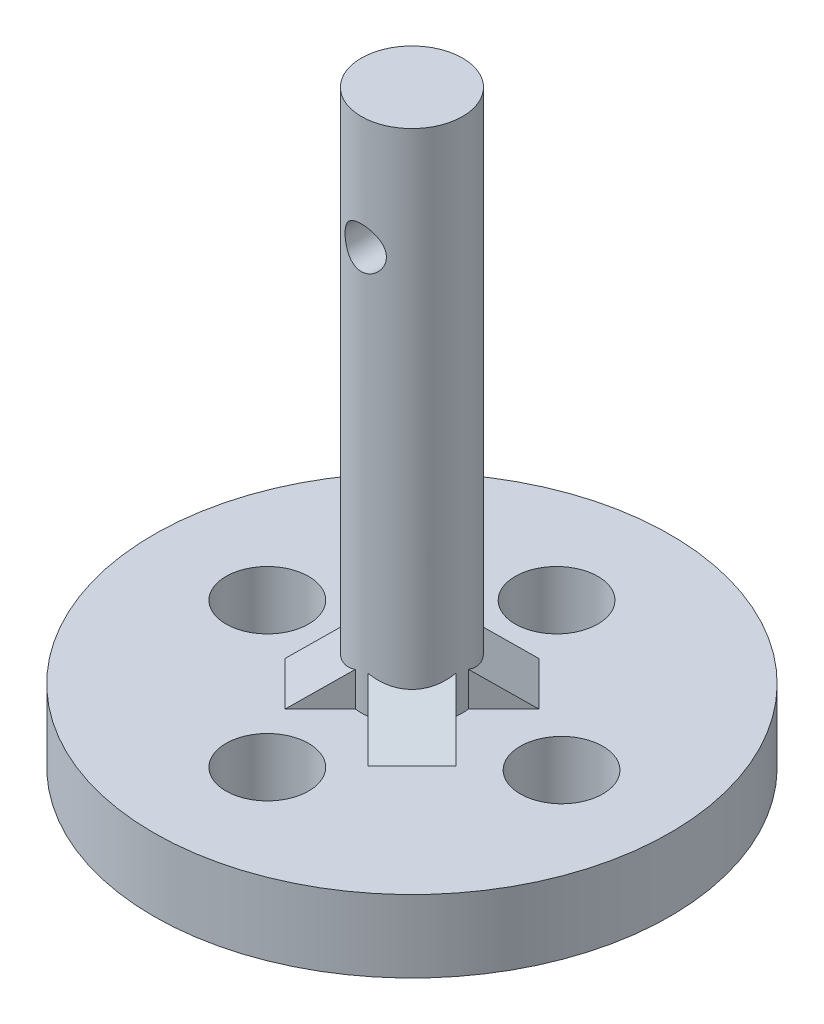
ISO-10303-21;
HEADER;
FILE_DESCRIPTION(('STEP AP214'),'2;1');
FILE_NAME('part.step','',(''),(''),'','','');
FILE_SCHEMA(('AUTOMOTIVE_DESIGN { 1 0 10303 214 1 1 1 1 }'));
ENDSEC;
DATA;
#1=APPLICATION_CONTEXT('core data for automotive mechanical design processes');
#2=APPLICATION_PROTOCOL_DEFINITION('international standard','automotive_design',2000,#1);
#3=PRODUCT_CONTEXT('',#1,'mechanical');
#4=PRODUCT('Part','Part','',(#3));
#5=PRODUCT_RELATED_PRODUCT_CATEGORY('part','',(#4));
#6=PRODUCT_DEFINITION_FORMATION('','',#4);
#7=PRODUCT_DEFINITION_CONTEXT('part definition',#1,'design');
#8=PRODUCT_DEFINITION('design','',#6,#7);
#9=PRODUCT_DEFINITION_SHAPE('','',#8);
#10=(LENGTH_UNIT() NAMED_UNIT(*) SI_UNIT(.MILLI.,.METRE.));
#11=(NAMED_UNIT(*) PLANE_ANGLE_UNIT() SI_UNIT($,.RADIAN.));
#12=(NAMED_UNIT(*) SI_UNIT($,.STERADIAN.) SOLID_ANGLE_UNIT());
#13=UNCERTAINTY_MEASURE_WITH_UNIT(LENGTH_MEASURE(1.E-05),#10,'distance_accuracy_value','');
#14=(GEOMETRIC_REPRESENTATION_CONTEXT(3) GLOBAL_UNCERTAINTY_ASSIGNED_CONTEXT((#13)) GLOBAL_UNIT_ASSIGNED_CONTEXT((#10,
#11,#12)) REPRESENTATION_CONTEXT('',''));
#15=CARTESIAN_POINT('',(0.,0.,0.));
#16=DIRECTION('',(0.,0.,1.));
#17=DIRECTION('',(1.,0.,0.));
#18=AXIS2_PLACEMENT_3D('',#15,#16,#17);
#19=CARTESIAN_POINT('',(0.,3.5,0.));
#20=DIRECTION('',(0.,-1.,0.));
#21=DIRECTION('',(0.,0.,-1.));
#22=AXIS2_PLACEMENT_3D('',#19,#20,#21);
#23=CYLINDRICAL_SURFACE('',#22,12.5);
#24=CARTESIAN_POINT('',(0.,3.5,0.));
#25=DIRECTION('',(0.,1.,0.));
#26=DIRECTION('',(0.,0.,1.));
#27=AXIS2_PLACEMENT_3D('',#24,#25,#26);
#28=CIRCLE('',#27,12.5);
#29=CARTESIAN_POINT('',(0.,3.5,12.5));
#30=VERTEX_POINT('',#29);
#31=EDGE_CURVE('E237',#30,#30,#28,.T.);
#32=ORIENTED_EDGE('',*,*,#31,.F.);
#33=EDGE_LOOP('',(#32));
#34=FACE_BOUND('',#33,.T.);
#35=CARTESIAN_POINT('',(0.,0.,0.));
#36=DIRECTION('',(0.,1.,0.));
#37=DIRECTION('',(0.,0.,1.));
#38=AXIS2_PLACEMENT_3D('',#35,#36,#37);
#39=CIRCLE('',#38,12.5);
#40=CARTESIAN_POINT('',(0.,0.,12.5));
#41=VERTEX_POINT('',#40);
#42=EDGE_CURVE('E234',#41,#41,#39,.T.);
#43=ORIENTED_EDGE('',*,*,#42,.T.);
#44=EDGE_LOOP('',(#43));
#45=FACE_BOUND('',#44,.T.);
#46=ADVANCED_FACE('F38',(#34,#45),#23,.T.);
#47=CARTESIAN_POINT('',(0.,3.5,0.));
#48=DIRECTION('',(0.,1.,0.));
#49=DIRECTION('',(0.,0.,1.));
#50=AXIS2_PLACEMENT_3D('',#47,#48,#49);
#51=PLANE('',#50);
#52=ORIENTED_EDGE('',*,*,#31,.T.);
#53=EDGE_LOOP('',(#52));
#54=FACE_BOUND('',#53,.T.);
#55=DIRECTION('',(0.707106781186546,0.,0.707106781186549));
#56=VECTOR('',#55,1.);
#57=CARTESIAN_POINT('',(3.0691286647991,3.5,-3.06912866479909));
#58=LINE('',#57,#56);
#59=CARTESIAN_POINT('',(4.12978883657892,3.5,-2.00846849301927));
#60=VERTEX_POINT('',#59);
#61=CARTESIAN_POINT('',(2.00846849301928,3.5,-4.12978883657892));
#62=VERTEX_POINT('',#61);
#63=EDGE_CURVE('E173',#60,#62,#58,.F.);
#64=ORIENTED_EDGE('',*,*,#63,.F.);
#65=DIRECTION('',(0.707106781186549,0.,-0.707106781186546));
#66=VECTOR('',#65,1.);
#67=CARTESIAN_POINT('',(1.06066017177982,3.5,1.06066017177982));
#68=LINE('',#67,#66);
#69=CARTESIAN_POINT('',(2.43042292496009,3.5,-0.309102581400447));
#70=VERTEX_POINT('',#69);
#71=EDGE_CURVE('E170',#70,#60,#68,.T.);
#72=ORIENTED_EDGE('',*,*,#71,.F.);
#73=CARTESIAN_POINT('',(0.,3.5,0.));
#74=DIRECTION('',(0.,1.,0.));
#75=DIRECTION('',(0.,0.,1.));
#76=AXIS2_PLACEMENT_3D('',#73,#74,#75);
#77=CIRCLE('',#76,2.45);
#78=CARTESIAN_POINT('',(2.43042292496009,3.5,0.309102581400456));
#79=VERTEX_POINT('',#78);
#80=EDGE_CURVE('E142',#79,#70,#77,.T.);
#81=ORIENTED_EDGE('',*,*,#80,.F.);
#82=DIRECTION('',(0.707106781186546,0.,0.707106781186549));
#83=VECTOR('',#82,1.);
#84=CARTESIAN_POINT('',(1.06066017177982,3.5,-1.06066017177982));
#85=LINE('',#84,#83);
#86=CARTESIAN_POINT('',(4.50601996303597,3.5,2.38469961947634));
#87=VERTEX_POINT('',#86);
#88=EDGE_CURVE('E198',#79,#87,#85,.T.);
#89=ORIENTED_EDGE('',*,*,#88,.T.);
#90=DIRECTION('',(-0.707106781186549,0.,0.707106781186546));
#91=VECTOR('',#90,1.);
#92=CARTESIAN_POINT('',(3.44535979125614,3.5,3.44535979125616));
#93=LINE('',#92,#91);
#94=CARTESIAN_POINT('',(2.38469961947632,3.5,4.50601996303598));
#95=VERTEX_POINT('',#94);
#96=EDGE_CURVE('E205',#95,#87,#93,.F.);
#97=ORIENTED_EDGE('',*,*,#96,.F.);
#98=DIRECTION('',(0.707106781186546,0.,0.707106781186549));
#99=VECTOR('',#98,1.);
#100=CARTESIAN_POINT('',(-1.06066017177982,3.5,1.06066017177982));
#101=LINE('',#100,#99);
#102=CARTESIAN_POINT('',(0.309102581400447,3.5,2.4304229249601));
#103=VERTEX_POINT('',#102);
#104=EDGE_CURVE('E202',#103,#95,#101,.T.);
#105=ORIENTED_EDGE('',*,*,#104,.F.);
#106=CARTESIAN_POINT('',(-0.309102581400456,3.5,2.43042292496009));
#107=VERTEX_POINT('',#106);
#108=EDGE_CURVE('E140',#107,#103,#77,.T.);
#109=ORIENTED_EDGE('',*,*,#108,.F.);
#110=DIRECTION('',(0.707106781186549,0.,-0.707106781186546));
#111=VECTOR('',#110,1.);
#112=CARTESIAN_POINT('',(1.06066017177982,3.5,1.06066017177982));
#113=LINE('',#112,#111);
#114=CARTESIAN_POINT('',(-2.00846849301929,3.5,4.12978883657892));
#115=VERTEX_POINT('',#114);
#116=EDGE_CURVE('E58',#115,#107,#113,.T.);
#117=ORIENTED_EDGE('',*,*,#116,.F.);
#118=DIRECTION('',(0.707106781186546,0.,0.707106781186549));
#119=VECTOR('',#118,1.);
#120=CARTESIAN_POINT('',(-3.0691286647991,3.5,3.06912866479909));
#121=LINE('',#120,#119);
#122=CARTESIAN_POINT('',(-4.12978883657892,3.5,2.00846849301927));
#123=VERTEX_POINT('',#122);
#124=EDGE_CURVE('E62',#123,#115,#121,.T.);
#125=ORIENTED_EDGE('',*,*,#124,.F.);
#126=DIRECTION('',(0.707106781186549,0.,-0.707106781186546));
#127=VECTOR('',#126,1.);
#128=CARTESIAN_POINT('',(-1.06066017177982,3.5,-1.06066017177982));
#129=LINE('',#128,#127);
#130=CARTESIAN_POINT('',(-2.4304229249601,3.5,0.309102581400447));
#131=VERTEX_POINT('',#130);
#132=EDGE_CURVE('E143',#123,#131,#129,.T.);
#133=ORIENTED_EDGE('',*,*,#132,.T.);
#134=CARTESIAN_POINT('',(-2.43042292496009,3.5,-0.309102581400456));
#135=VERTEX_POINT('',#134);
#136=EDGE_CURVE('E130',#135,#131,#77,.T.);
#137=ORIENTED_EDGE('',*,*,#136,.F.);
#138=DIRECTION('',(0.707106781186546,0.,0.707106781186549));
#139=VECTOR('',#138,1.);
#140=CARTESIAN_POINT('',(-1.06066017177982,3.5,1.06066017177982));
#141=LINE('',#140,#139);
#142=CARTESIAN_POINT('',(-4.64330057061032,3.5,-2.52198022705069));
#143=VERTEX_POINT('',#142);
#144=EDGE_CURVE('E188',#143,#135,#141,.T.);
#145=ORIENTED_EDGE('',*,*,#144,.F.);
#146=DIRECTION('',(-0.707106781186549,0.,0.707106781186546));
#147=VECTOR('',#146,1.);
#148=CARTESIAN_POINT('',(-3.5826403988305,3.5,-3.58264039883051));
#149=LINE('',#148,#147);
#150=CARTESIAN_POINT('',(-2.52198022705067,3.5,-4.64330057061033));
#151=VERTEX_POINT('',#150);
#152=EDGE_CURVE('E190',#151,#143,#149,.T.);
#153=ORIENTED_EDGE('',*,*,#152,.F.);
#154=DIRECTION('',(0.707106781186546,0.,0.707106781186549));
#155=VECTOR('',#154,1.);
#156=CARTESIAN_POINT('',(1.06066017177982,3.5,-1.06066017177982));
#157=LINE('',#156,#155);
#158=CARTESIAN_POINT('',(-0.309102581400447,3.5,-2.4304229249601));
#159=VERTEX_POINT('',#158);
#160=EDGE_CURVE('E185',#151,#159,#157,.T.);
#161=ORIENTED_EDGE('',*,*,#160,.T.);
#162=CARTESIAN_POINT('',(0.309102581400456,3.5,-2.43042292496009));
#163=VERTEX_POINT('',#162);
#164=EDGE_CURVE('E139',#163,#159,#77,.T.);
#165=ORIENTED_EDGE('',*,*,#164,.F.);
#166=DIRECTION('',(0.707106781186549,0.,-0.707106781186546));
#167=VECTOR('',#166,1.);
#168=CARTESIAN_POINT('',(-1.06066017177982,3.5,-1.06066017177982));
#169=LINE('',#168,#167);
#170=EDGE_CURVE('E166',#163,#62,#169,.T.);
#171=ORIENTED_EDGE('',*,*,#170,.T.);
#172=EDGE_LOOP('',(#64,#72,#81,#89,#97,#105,#109,#117,#125,#133,#137,#145,#153,#161,#165,#171));
#173=FACE_BOUND('',#172,.T.);
#174=CARTESIAN_POINT('',(7.24150005218133,3.5,0.));
#175=DIRECTION('',(0.,1.,0.));
#176=DIRECTION('',(0.,0.,1.));
#177=AXIS2_PLACEMENT_3D('',#174,#175,#176);
#178=CIRCLE('',#177,2.);
#179=CARTESIAN_POINT('',(7.24150005218133,3.5,2.));
#180=VERTEX_POINT('',#179);
#181=EDGE_CURVE('E213',#180,#180,#178,.T.);
#182=ORIENTED_EDGE('',*,*,#181,.F.);
#183=EDGE_LOOP('',(#182));
#184=FACE_BOUND('',#183,.T.);
#185=CARTESIAN_POINT('',(0.,3.5,7.));
#186=DIRECTION('',(0.,1.,0.));
#187=DIRECTION('',(0.,0.,1.));
#188=AXIS2_PLACEMENT_3D('',#185,#186,#187);
#189=CIRCLE('',#188,2.);
#190=CARTESIAN_POINT('',(0.,3.5,9.));
#191=VERTEX_POINT('',#190);
#192=EDGE_CURVE('E208',#191,#191,#189,.T.);
#193=ORIENTED_EDGE('',*,*,#192,.F.);
#194=EDGE_LOOP('',(#193));
#195=FACE_BOUND('',#194,.T.);
#196=CARTESIAN_POINT('',(-7.,3.5,0.));
#197=DIRECTION('',(0.,1.,0.));
#198=DIRECTION('',(0.,0.,1.));
#199=AXIS2_PLACEMENT_3D('',#196,#197,#198);
#200=CIRCLE('',#199,2.);
#201=CARTESIAN_POINT('',(-7.,3.5,2.));
#202=VERTEX_POINT('',#201);
#203=EDGE_CURVE('E212',#202,#202,#200,.T.);
#204=ORIENTED_EDGE('',*,*,#203,.F.);
#205=EDGE_LOOP('',(#204));
#206=FACE_BOUND('',#205,.T.);
#207=CARTESIAN_POINT('',(0.,3.5,-7.));
#208=DIRECTION('',(0.,1.,0.));
#209=DIRECTION('',(0.,0.,1.));
#210=AXIS2_PLACEMENT_3D('',#207,#208,#209);
#211=CIRCLE('',#210,2.);
#212=CARTESIAN_POINT('',(0.,3.5,-5.));
#213=VERTEX_POINT('',#212);
#214=EDGE_CURVE('E224',#213,#213,#211,.T.);
#215=ORIENTED_EDGE('',*,*,#214,.F.);
#216=EDGE_LOOP('',(#215));
#217=FACE_BOUND('',#216,.T.);
#218=ADVANCED_FACE('F144',(#54,#173,#184,#195,#206,#217),#51,.T.);
#219=CARTESIAN_POINT('',(0.,0.,0.));
#220=DIRECTION('',(0.,1.,0.));
#221=DIRECTION('',(0.,0.,1.));
#222=AXIS2_PLACEMENT_3D('',#219,#220,#221);
#223=PLANE('',#222);
#224=ORIENTED_EDGE('',*,*,#42,.F.);
#225=EDGE_LOOP('',(#224));
#226=FACE_BOUND('',#225,.T.);
#227=CARTESIAN_POINT('',(7.24150005218133,0.,0.));
#228=DIRECTION('',(0.,1.,0.));
#229=DIRECTION('',(0.,0.,1.));
#230=AXIS2_PLACEMENT_3D('',#227,#228,#229);
#231=CIRCLE('',#230,2.);
#232=CARTESIAN_POINT('',(7.24150005218133,0.,2.));
#233=VERTEX_POINT('',#232);
#234=EDGE_CURVE('E209',#233,#233,#231,.T.);
#235=ORIENTED_EDGE('',*,*,#234,.T.);
#236=EDGE_LOOP('',(#235));
#237=FACE_BOUND('',#236,.T.);
#238=CARTESIAN_POINT('',(0.,0.,7.));
#239=DIRECTION('',(0.,1.,0.));
#240=DIRECTION('',(0.,0.,1.));
#241=AXIS2_PLACEMENT_3D('',#238,#239,#240);
#242=CIRCLE('',#241,2.);
#243=CARTESIAN_POINT('',(0.,0.,9.));
#244=VERTEX_POINT('',#243);
#245=EDGE_CURVE('E216',#244,#244,#242,.T.);
#246=ORIENTED_EDGE('',*,*,#245,.T.);
#247=EDGE_LOOP('',(#246));
#248=FACE_BOUND('',#247,.T.);
#249=CARTESIAN_POINT('',(-7.,0.,0.));
#250=DIRECTION('',(0.,1.,0.));
#251=DIRECTION('',(0.,0.,1.));
#252=AXIS2_PLACEMENT_3D('',#249,#250,#251);
#253=CIRCLE('',#252,2.);
#254=CARTESIAN_POINT('',(-7.,0.,2.));
#255=VERTEX_POINT('',#254);
#256=EDGE_CURVE('E221',#255,#255,#253,.T.);
#257=ORIENTED_EDGE('',*,*,#256,.T.);
#258=EDGE_LOOP('',(#257));
#259=FACE_BOUND('',#258,.T.);
#260=CARTESIAN_POINT('',(0.,0.,-7.));
#261=DIRECTION('',(0.,1.,0.));
#262=DIRECTION('',(0.,0.,1.));
#263=AXIS2_PLACEMENT_3D('',#260,#261,#262);
#264=CIRCLE('',#263,2.);
#265=CARTESIAN_POINT('',(0.,0.,-5.));
#266=VERTEX_POINT('',#265);
#267=EDGE_CURVE('E227',#266,#266,#264,.T.);
#268=ORIENTED_EDGE('',*,*,#267,.T.);
#269=EDGE_LOOP('',(#268));
#270=FACE_BOUND('',#269,.T.);
#271=ADVANCED_FACE('F336',(#226,#237,#248,#259,#270),#223,.F.);
#272=CARTESIAN_POINT('',(0.,28.5,0.));
#273=DIRECTION('',(0.,-1.,0.));
#274=DIRECTION('',(0.,0.,-1.));
#275=AXIS2_PLACEMENT_3D('',#272,#273,#274);
#276=CYLINDRICAL_SURFACE('',#275,2.45);
#277=CARTESIAN_POINT('',(0.,24.,-2.45));
#278=CARTESIAN_POINT('',(-0.0536589367703449,23.9999946218099,-2.4499959895045));
#279=CARTESIAN_POINT('',(-0.10740686621529,23.9956553668991,-2.44821661039311));
#280=CARTESIAN_POINT('',(-0.213383659784766,23.9784503808,-2.44127145292646));
#281=CARTESIAN_POINT('',(-0.265608084618532,23.9655619138055,-2.43609664515377));
#282=CARTESIAN_POINT('',(-0.366832691632844,23.9318096118804,-2.42291752428269));
#283=CARTESIAN_POINT('',(-0.415842980270308,23.9109723345189,-2.41492263989994));
#284=CARTESIAN_POINT('',(-0.509626353878585,23.8620213231173,-2.3968864283533));
#285=CARTESIAN_POINT('',(-0.554400811854337,23.8339099580169,-2.38684576765977));
#286=CARTESIAN_POINT('',(-0.640686440667424,23.769764537089,-2.36518224664398));
#287=CARTESIAN_POINT('',(-0.681964646093683,23.7334342747117,-2.3535089486563));
#288=CARTESIAN_POINT('',(-0.758040964916322,23.6545080303574,-2.33012039656547));
#289=CARTESIAN_POINT('',(-0.792835792351389,23.6119088906033,-2.31840512423766));
#290=CARTESIAN_POINT('',(-0.85656283024562,23.5192368272157,-2.29564805850799));
#291=CARTESIAN_POINT('',(-0.885144764759956,23.4689075489517,-2.28466338426556));
#292=CARTESIAN_POINT('',(-0.933333305120254,23.3636412564063,-2.26540667076149));
#293=CARTESIAN_POINT('',(-0.952944349362637,23.3087065366459,-2.2571332906483));
#294=CARTESIAN_POINT('',(-0.981682541168728,23.1984682981396,-2.24477953486603));
#295=CARTESIAN_POINT('',(-0.991256893941519,23.1433020485017,-2.24052124028536));
#296=CARTESIAN_POINT('',(-1.00104609480797,23.0319942855991,-2.23616601681074));
#297=CARTESIAN_POINT('',(-1.00126581144282,22.9758532948509,-2.23606692329619));
#298=CARTESIAN_POINT('',(-0.992677397097407,22.8685620608712,-2.23989010237453));
#299=CARTESIAN_POINT('',(-0.984527095588799,22.8173466568171,-2.24351935780235));
#300=CARTESIAN_POINT('',(-0.960530043846643,22.7170862430505,-2.25389687053926));
#301=CARTESIAN_POINT('',(-0.944681888295769,22.6680416314216,-2.26064569734523));
#302=CARTESIAN_POINT('',(-0.905433431897868,22.5723041722308,-2.27665232818393));
#303=CARTESIAN_POINT('',(-0.881882565226115,22.5256816753723,-2.2859595083092));
#304=CARTESIAN_POINT('',(-0.828003259854282,22.4368741252236,-2.30602159618456));
#305=CARTESIAN_POINT('',(-0.797672211783243,22.3946907895737,-2.31677706067541));
#306=CARTESIAN_POINT('',(-0.728215180983228,22.3123726270922,-2.33958152809153));
#307=CARTESIAN_POINT('',(-0.688576647965505,22.2726785831335,-2.35166483720682));
#308=CARTESIAN_POINT('',(-0.603080968054252,22.2003569106769,-2.37502751605708));
#309=CARTESIAN_POINT('',(-0.557222482465314,22.1677308073203,-2.38630671192652));
#310=CARTESIAN_POINT('',(-0.459295197232259,22.1098600783104,-2.40709424802756));
#311=CARTESIAN_POINT('',(-0.407114768284853,22.0847878001371,-2.41655966967101));
#312=CARTESIAN_POINT('',(-0.298792073961533,22.0439304106493,-2.43232634038115));
#313=CARTESIAN_POINT('',(-0.242651924718758,22.0281403802547,-2.43862926513708));
#314=CARTESIAN_POINT('',(-0.131692751535913,22.0072022310584,-2.44705167071009));
#315=CARTESIAN_POINT('',(-0.0770030264895637,22.0014621527635,-2.44940349863822));
#316=CARTESIAN_POINT('',(0.0326038784588683,21.9990307287841,-2.4503953459309));
#317=CARTESIAN_POINT('',(0.0875209922920319,22.0023369168173,-2.44903637696965));
#318=CARTESIAN_POINT('',(0.193297618614874,22.0174743708809,-2.44291078305012));
#319=CARTESIAN_POINT('',(0.244226309355996,22.0288959347353,-2.43830800814918));
#320=CARTESIAN_POINT('',(0.343393375810227,22.0593762849797,-2.42633001603489));
#321=CARTESIAN_POINT('',(0.391631407596869,22.0784360451654,-2.4189544453245));
#322=CARTESIAN_POINT('',(0.48572507363729,22.1242748336798,-2.40185957553599));
#323=CARTESIAN_POINT('',(0.531461272655304,22.1512738972997,-2.39207498169586));
#324=CARTESIAN_POINT('',(0.617916244866223,22.2119819797083,-2.37121498689614));
#325=CARTESIAN_POINT('',(0.658632952576623,22.2456937458996,-2.36013905818556));
#326=CARTESIAN_POINT('',(0.736829556835726,22.3215824913578,-2.33695491745384));
#327=CARTESIAN_POINT('',(0.773895087021625,22.3641818466529,-2.32482805294359));
#328=CARTESIAN_POINT('',(0.840459909981573,22.4552005421936,-2.30160231463605));
#329=CARTESIAN_POINT('',(0.869957734832942,22.5036210089006,-2.29050364054524));
#330=CARTESIAN_POINT('',(0.920798190410907,22.6057648129474,-2.27054814657375));
#331=CARTESIAN_POINT('',(0.942040223888239,22.6595441036225,-2.26171939912782));
#332=CARTESIAN_POINT('',(0.974994528041244,22.7703876823192,-2.24771268819077));
#333=CARTESIAN_POINT('',(0.986714229650422,22.8274493715483,-2.24253187838384));
#334=CARTESIAN_POINT('',(0.999567223365858,22.9386607168657,-2.23683039933877));
#335=CARTESIAN_POINT('',(1.00142363432009,22.992710942261,-2.23599153374077));
#336=CARTESIAN_POINT('',(0.996411635241589,23.100317204127,-2.23822954211903));
#337=CARTESIAN_POINT('',(0.98954444026991,23.1538733083744,-2.24130587077043));
#338=CARTESIAN_POINT('',(0.967879103098146,23.2566118951436,-2.25074196050452));
#339=CARTESIAN_POINT('',(0.953433613015272,23.3058834466331,-2.2569552938814));
#340=CARTESIAN_POINT('',(0.917358788786446,23.4013193462796,-2.27185644751307));
#341=CARTESIAN_POINT('',(0.895727453331882,23.4474828245037,-2.28054495702575));
#342=CARTESIAN_POINT('',(0.844430091819562,23.5383470867268,-2.30005040748499));
#343=CARTESIAN_POINT('',(0.814366952885288,23.5828029312436,-2.31096235174869));
#344=CARTESIAN_POINT('',(0.747627918374244,23.6662655309764,-2.33340757553123));
#345=CARTESIAN_POINT('',(0.710949881814805,23.705270514687,-2.34494105536676));
#346=CARTESIAN_POINT('',(0.629027481839117,23.7794765894725,-2.36828165195304));
#347=CARTESIAN_POINT('',(0.583367796330864,23.8142324580545,-2.38005316120318));
#348=CARTESIAN_POINT('',(0.486422313608788,23.8756045514965,-2.40174034308204));
#349=CARTESIAN_POINT('',(0.435133945106979,23.9022170350999,-2.41165516189566));
#350=CARTESIAN_POINT('',(0.329261786440424,23.9459442518133,-2.42835517234836));
#351=CARTESIAN_POINT('',(0.274752330053223,23.9632186516715,-2.43519261774534));
#352=CARTESIAN_POINT('',(0.163366530545095,23.9882044101541,-2.44518154789045));
#353=CARTESIAN_POINT('',(0.10649824177016,23.9959459224201,-2.44834465319888));
#354=CARTESIAN_POINT('',(0.0329808357898422,23.9995937845306,-2.44983470534052));
#355=CARTESIAN_POINT('',(0.0164946224969801,24.0000016532421,-2.45000123281625));
#356=CARTESIAN_POINT('',(0.,24.,-2.45));
#357=B_SPLINE_CURVE_WITH_KNOTS('',3,(#277,#278,#279,#280,#281,#282,#283,#284,#285,#286,#287,
#288,#289,#290,#291,#292,#293,#294,#295,#296,#297,#298,#299,#300,#301,#302,#303,#304,#305,#306,
#307,#308,#309,#310,#311,#312,#313,#314,#315,#316,#317,#318,#319,#320,#321,#322,#323,#324,#325,
#326,#327,#328,#329,#330,#331,#332,#333,#334,#335,#336,#337,#338,#339,#340,#341,#342,#343,#344,
#345,#346,#347,#348,#349,#350,#351,#352,#353,#354,#355,#356),.UNSPECIFIED.,.T.,.F.,(4,2,2,2,2,2,
2,2,2,2,2,2,2,2,2,2,2,2,2,2,2,2,2,2,2,2,2,2,2,2,2,2,2,2,2,2,2,2,2,4),(0.,0.160931320118998,
0.322292346710306,0.483118910098522,0.643893163150697,0.811801547973565,0.979794803455429,
1.15564455069161,1.33140720096486,1.49895408106267,1.66641376173847,1.82164949136323,
1.97691357142172,2.13541475310537,2.29397703973437,2.46534871841165,2.63675733942842,
2.81182321404902,2.98679622956875,3.15106461083829,3.31528821210639,3.47176133584889,
3.62825441474158,3.78957615349119,3.95096405488677,4.12343614693837,4.29594166848948,
4.47048779619668,4.6448975823227,4.80632412512275,4.96772818621007,5.12221225606975,
5.27673938695415,5.44033758140234,5.6039888215008,5.77887939450302,5.9538501959997,
6.12572618223473,6.29705709633878,6.34652698025885),.UNSPECIFIED.);
#358=CARTESIAN_POINT('',(0.,24.,-2.45));
#359=VERTEX_POINT('',#358);
#360=EDGE_CURVE('E41',#359,#359,#357,.T.);
#361=ORIENTED_EDGE('',*,*,#360,.T.);
#362=EDGE_LOOP('',(#361));
#363=FACE_BOUND('',#362,.T.);
#364=CARTESIAN_POINT('',(1.,23.,2.2366269246345));
#365=CARTESIAN_POINT('',(0.9999945254411,22.9465522787194,2.23663213392625));
#366=CARTESIAN_POINT('',(0.99568791813929,22.8930128902526,2.23857054949507));
#367=CARTESIAN_POINT('',(0.978624760850482,22.7874726081027,2.24607987318269));
#368=CARTESIAN_POINT('',(0.965844845282795,22.735476385172,2.25166082511589));
#369=CARTESIAN_POINT('',(0.9324092380939,22.6347367549452,2.26570914652223));
#370=CARTESIAN_POINT('',(0.911784769801338,22.5859813407269,2.27416505893823));
#371=CARTESIAN_POINT('',(0.86333685889847,22.4926375209758,2.29299414650861));
#372=CARTESIAN_POINT('',(0.835515322256571,22.4480480164522,2.30336681384965));
#373=CARTESIAN_POINT('',(0.771687796649469,22.3616133457599,2.3255532600516));
#374=CARTESIAN_POINT('',(0.735320527708287,22.3200470501273,2.33741463987134));
#375=CARTESIAN_POINT('',(0.656193174000866,22.2433981758226,2.36084989259726));
#376=CARTESIAN_POINT('',(0.613430692709378,22.2083180388248,2.37242365581856));
#377=CARTESIAN_POINT('',(0.52055593835753,22.1442356435622,2.39455418680611));
#378=CARTESIAN_POINT('',(0.470212957265957,22.1155444754769,2.40504915909942));
#379=CARTESIAN_POINT('',(0.364909739133311,22.0671580570805,2.42326007786417));
#380=CARTESIAN_POINT('',(0.309951485268243,22.0474589660682,2.43097721050974));
#381=CARTESIAN_POINT('',(0.199902981360735,22.018618336506,2.44242576321425));
#382=CARTESIAN_POINT('',(0.144957734114339,22.0089966342208,2.44633775011258));
#383=CARTESIAN_POINT('',(0.0341026242172528,21.9990351455833,2.45038946217439));
#384=CARTESIAN_POINT('',(-0.0218068553429673,21.9986917542504,2.45053065243716));
#385=CARTESIAN_POINT('',(-0.129522545234679,22.0070390369517,2.44713301050286));
#386=CARTESIAN_POINT('',(-0.18137759616484,22.0152028940506,2.44380877247275));
#387=CARTESIAN_POINT('',(-0.282907099314785,22.0394334582807,2.43414568836199));
#388=CARTESIAN_POINT('',(-0.332581390875147,22.0555007466074,2.42780662058058));
#389=CARTESIAN_POINT('',(-0.429243200515009,22.0952767280878,2.41260905431644));
#390=CARTESIAN_POINT('',(-0.476178489714186,22.1190977103849,2.40371377321503));
#391=CARTESIAN_POINT('',(-0.565507677984423,22.1735974165504,2.38428058040925));
#392=CARTESIAN_POINT('',(-0.607899987625488,22.2042785290268,2.37374209695097));
#393=CARTESIAN_POINT('',(-0.690002338465851,22.2740572306811,2.35124017568277));
#394=CARTESIAN_POINT('',(-0.729333817742482,22.3135853439551,2.3392285710703));
#395=CARTESIAN_POINT('',(-0.800968913396704,22.3987137777587,2.31567997305941));
#396=CARTESIAN_POINT('',(-0.833270033462839,22.4443162459109,2.30414314941956));
#397=CARTESIAN_POINT('',(-0.890844181053675,22.5420600822621,2.28251480621588));
#398=CARTESIAN_POINT('',(-0.915873263564839,22.5943582730283,2.27247799072508));
#399=CARTESIAN_POINT('',(-0.956616694211736,22.7029459427819,2.25563214056146));
#400=CARTESIAN_POINT('',(-0.972337388417182,22.7592326731695,2.24882090745721));
#401=CARTESIAN_POINT('',(-0.993076609452517,22.8704143847943,2.23973656827757));
#402=CARTESIAN_POINT('',(-0.99870670542277,22.9251738218923,2.23720470873898));
#403=CARTESIAN_POINT('',(-1.00089476362218,23.0349016682772,2.23622730304565));
#404=CARTESIAN_POINT('',(-0.997455659477513,23.0898700042476,2.2377804355127));
#405=CARTESIAN_POINT('',(-0.982160421584939,23.1949644570464,2.24453158154483));
#406=CARTESIAN_POINT('',(-0.970824693298965,23.2451826182233,2.2495040079833));
#407=CARTESIAN_POINT('',(-0.940740109467885,23.3429670272436,2.26224953215345));
#408=CARTESIAN_POINT('',(-0.921989567209347,23.3905326688838,2.27002326708788));
#409=CARTESIAN_POINT('',(-0.876742219971695,23.4838633875477,2.28788905348394));
#410=CARTESIAN_POINT('',(-0.849956472954175,23.5294720391218,2.29806386331348));
#411=CARTESIAN_POINT('',(-0.789690565609248,23.6157605096533,2.31946335240262));
#412=CARTESIAN_POINT('',(-0.756207594116742,23.6564382473016,2.33068847147376));
#413=CARTESIAN_POINT('',(-0.68043640495684,23.7349892221697,2.35397398457851));
#414=CARTESIAN_POINT('',(-0.637666877062851,23.7724007628683,2.36603168886143));
#415=CARTESIAN_POINT('',(-0.546172855284004,23.8395928748595,2.38881042080472));
#416=CARTESIAN_POINT('',(-0.497448027592267,23.8693730181064,2.3995313734693));
#417=CARTESIAN_POINT('',(-0.395174124922388,23.9203827452162,2.41847917949699));
#418=CARTESIAN_POINT('',(-0.341619980504674,23.9416032128947,2.42670337147903));
#419=CARTESIAN_POINT('',(-0.231281913121719,23.9745866068623,2.43968989555527));
#420=CARTESIAN_POINT('',(-0.174499845761633,23.9863549091197,2.44445419533318));
#421=CARTESIAN_POINT('',(-0.0634540340628055,23.9994429133112,2.44976613383554));
#422=CARTESIAN_POINT('',(-0.00927914498720131,24.0014144980255,2.45057677921297));
#423=CARTESIAN_POINT('',(0.0986063379469114,23.9965896693879,2.44860893406247));
#424=CARTESIAN_POINT('',(0.152317006075016,23.9897946857336,2.44583102877396));
#425=CARTESIAN_POINT('',(0.255927691048403,23.9680968511327,2.4371331354279));
#426=CARTESIAN_POINT('',(0.305894967287514,23.9534689215558,2.43131984647652));
#427=CARTESIAN_POINT('',(0.402652673660338,23.9168145438866,2.41718097765365));
#428=CARTESIAN_POINT('',(0.449442486042495,23.8947866620433,2.40885491095981));
#429=CARTESIAN_POINT('',(0.540820511379461,23.8428509684407,2.39003907388836));
#430=CARTESIAN_POINT('',(0.585216499135735,23.8126346382359,2.37946915032947));
#431=CARTESIAN_POINT('',(0.668494151649558,23.7456367134784,2.35742958265702));
#432=CARTESIAN_POINT('',(0.707373866131611,23.7088528072915,2.34595962255086));
#433=CARTESIAN_POINT('',(0.781131387466859,23.6269480756605,2.3224831729101));
#434=CARTESIAN_POINT('',(0.815586580379976,23.5814414619721,2.31049008254166));
#435=CARTESIAN_POINT('',(0.87642456271159,23.4849066473012,2.28810734543668));
#436=CARTESIAN_POINT('',(0.902802936192435,23.4338754463576,2.27771857738371));
#437=CARTESIAN_POINT('',(0.94639636107752,23.3280052076256,2.25995284556183));
#438=CARTESIAN_POINT('',(0.96367995660143,23.273198280204,2.25255345323359));
#439=CARTESIAN_POINT('',(0.988582911266113,23.1611631071053,2.24173955430265));
#440=CARTESIAN_POINT('',(0.996234690951388,23.103943657843,2.23831168273977));
#441=CARTESIAN_POINT('',(0.999640120605059,23.0310491022702,2.23678708046053));
#442=CARTESIAN_POINT('',(1.00000159054956,23.0155284199687,2.23662541115427));
#443=CARTESIAN_POINT('',(1.,23.,2.2366269246345));
#444=B_SPLINE_CURVE_WITH_KNOTS('',3,(#364,#365,#366,#367,#368,#369,#370,#371,#372,#373,#374,
#375,#376,#377,#378,#379,#380,#381,#382,#383,#384,#385,#386,#387,#388,#389,#390,#391,#392,#393,
#394,#395,#396,#397,#398,#399,#400,#401,#402,#403,#404,#405,#406,#407,#408,#409,#410,#411,#412,
#413,#414,#415,#416,#417,#418,#419,#420,#421,#422,#423,#424,#425,#426,#427,#428,#429,#430,#431,
#432,#433,#434,#435,#436,#437,#438,#439,#440,#441,#442,#443),.UNSPECIFIED.,.T.,.F.,(4,2,2,2,2,2,
2,2,2,2,2,2,2,2,2,2,2,2,2,2,2,2,2,2,2,2,2,2,2,2,2,2,2,2,2,2,2,2,2,4),(0.,0.16030015704848,
0.321044198733496,0.481155022135964,0.64122348741368,0.809949474494949,0.978738848685191,
1.15450369832885,1.33019340478079,1.4970672330907,1.66387622356694,1.8209361748533,
1.97800767760278,2.1374634169019,2.29697476330877,2.46733563085488,2.63775689111756,
2.8133672877127,2.98885782222303,3.15329792529085,3.31768484322579,3.47215264694338,
3.62665560905272,3.78756458552305,3.94854124593734,4.12199407599801,4.29545663291133,
4.46910344538336,4.64265142525195,4.80448057590029,4.96628333794452,5.12274732720819,
5.27924164908577,5.44273919230147,5.60629439670884,5.78044857262995,5.95469779665428,
6.12761424418269,6.29994708751416,6.34651985245266),.UNSPECIFIED.);
#445=CARTESIAN_POINT('',(1.,23.,2.2366269246345));
#446=VERTEX_POINT('',#445);
#447=EDGE_CURVE('E256',#446,#446,#444,.T.);
#448=ORIENTED_EDGE('',*,*,#447,.T.);
#449=EDGE_LOOP('',(#448));
#450=FACE_BOUND('',#449,.T.);
#451=DIRECTION('',(0.,-1.,0.));
#452=VECTOR('',#451,1.);
#453=CARTESIAN_POINT('',(-0.309102581400456,28.5,2.43042292496009));
#454=LINE('',#453,#452);
#455=CARTESIAN_POINT('',(-0.309102581400456,5.16108960935015,2.43042292496009));
#456=VERTEX_POINT('',#455);
#457=EDGE_CURVE('E149',#456,#107,#454,.T.);
#458=ORIENTED_EDGE('',*,*,#457,.T.);
#459=ORIENTED_EDGE('',*,*,#108,.T.);
#460=DIRECTION('',(0.,-1.,0.));
#461=VECTOR('',#460,1.);
#462=CARTESIAN_POINT('',(0.309102581400447,28.5,2.4304229249601));
#463=LINE('',#462,#461);
#464=CARTESIAN_POINT('',(0.309102581400447,5.30729778353784,2.4304229249601));
#465=VERTEX_POINT('',#464);
#466=EDGE_CURVE('E247',#103,#465,#463,.F.);
#467=ORIENTED_EDGE('',*,*,#466,.T.);
#468=CARTESIAN_POINT('',(0.,6.5,0.));
#469=DIRECTION('',(-0.370732135403674,-0.851537061764233,-0.370732135403675));
#470=DIRECTION('',(0.602127630805156,-0.524294413895415,0.602127630805158));
#471=AXIS2_PLACEMENT_3D('',#468,#469,#470);
#472=ELLIPSE('',#471,2.87715016763221,2.45);
#473=CARTESIAN_POINT('',(2.43042292496009,5.30729778353784,0.309102581400456));
#474=VERTEX_POINT('',#473);
#475=EDGE_CURVE('E245',#465,#474,#472,.F.);
#476=ORIENTED_EDGE('',*,*,#475,.T.);
#477=DIRECTION('',(0.,-1.,0.));
#478=VECTOR('',#477,1.);
#479=CARTESIAN_POINT('',(2.43042292496009,28.5,0.309102581400456));
#480=LINE('',#479,#478);
#481=EDGE_CURVE('E240',#79,#474,#480,.F.);
#482=ORIENTED_EDGE('',*,*,#481,.F.);
#483=ORIENTED_EDGE('',*,*,#80,.T.);
#484=DIRECTION('',(0.,-1.,0.));
#485=VECTOR('',#484,1.);
#486=CARTESIAN_POINT('',(2.4304229249601,28.5,-0.309102581400447));
#487=LINE('',#486,#485);
#488=CARTESIAN_POINT('',(2.4304229249601,5.16108960935015,-0.309102581400447));
#489=VERTEX_POINT('',#488);
#490=EDGE_CURVE('E50',#70,#489,#487,.F.);
#491=ORIENTED_EDGE('',*,*,#490,.T.);
#492=CARTESIAN_POINT('',(0.,6.5,0.));
#493=DIRECTION('',(-0.402048688257103,-0.8226261025165,0.402048688257102));
#494=DIRECTION('',(0.581684495470478,-0.568582707667507,-0.581684495470476));
#495=AXIS2_PLACEMENT_3D('',#492,#493,#494);
#496=ELLIPSE('',#495,2.97826678791883,2.45);
#497=CARTESIAN_POINT('',(0.309102581400456,5.16108960935015,-2.43042292496009));
#498=VERTEX_POINT('',#497);
#499=EDGE_CURVE('E254',#489,#498,#496,.F.);
#500=ORIENTED_EDGE('',*,*,#499,.T.);
#501=DIRECTION('',(0.,-1.,0.));
#502=VECTOR('',#501,1.);
#503=CARTESIAN_POINT('',(0.309102581400456,28.5,-2.43042292496009));
#504=LINE('',#503,#502);
#505=EDGE_CURVE('E251',#163,#498,#504,.F.);
#506=ORIENTED_EDGE('',*,*,#505,.F.);
#507=ORIENTED_EDGE('',*,*,#164,.T.);
#508=DIRECTION('',(0.,-1.,0.));
#509=VECTOR('',#508,1.);
#510=CARTESIAN_POINT('',(-0.309102581400447,28.5,-2.4304229249601));
#511=LINE('',#510,#509);
#512=CARTESIAN_POINT('',(-0.309102581400447,5.35300007757345,-2.43042292496009));
#513=VERTEX_POINT('',#512);
#514=EDGE_CURVE('E180',#513,#159,#511,.T.);
#515=ORIENTED_EDGE('',*,*,#514,.F.);
#516=CARTESIAN_POINT('',(0.,6.5,0.));
#517=DIRECTION('',(-0.360267781309426,0.86047327181079,-0.360267781309427));
#518=DIRECTION('',(-0.608446485527184,-0.509495582413856,-0.608446485527186));
#519=AXIS2_PLACEMENT_3D('',#516,#517,#518);
#520=ELLIPSE('',#519,2.84727031072585,2.45);
#521=CARTESIAN_POINT('',(-2.43042292496009,5.35300007757345,-0.309102581400456));
#522=VERTEX_POINT('',#521);
#523=EDGE_CURVE('E249',#513,#522,#520,.T.);
#524=ORIENTED_EDGE('',*,*,#523,.T.);
#525=DIRECTION('',(0.,-1.,0.));
#526=VECTOR('',#525,1.);
#527=CARTESIAN_POINT('',(-2.43042292496009,28.5,-0.309102581400456));
#528=LINE('',#527,#526);
#529=EDGE_CURVE('E137',#522,#135,#528,.T.);
#530=ORIENTED_EDGE('',*,*,#529,.T.);
#531=ORIENTED_EDGE('',*,*,#136,.T.);
#532=DIRECTION('',(0.,-1.,0.));
#533=VECTOR('',#532,1.);
#534=CARTESIAN_POINT('',(-2.4304229249601,28.5,0.309102581400447));
#535=LINE('',#534,#533);
#536=CARTESIAN_POINT('',(-2.4304229249601,5.16108960935015,0.309102581400447));
#537=VERTEX_POINT('',#536);
#538=EDGE_CURVE('E134',#537,#131,#535,.T.);
#539=ORIENTED_EDGE('',*,*,#538,.F.);
#540=CARTESIAN_POINT('',(0.,6.5,0.));
#541=DIRECTION('',(-0.402048688257103,0.8226261025165,0.402048688257102));
#542=DIRECTION('',(-0.581684495470478,-0.568582707667507,0.581684495470476));
#543=AXIS2_PLACEMENT_3D('',#540,#541,#542);
#544=ELLIPSE('',#543,2.97826678791883,2.45);
#545=EDGE_CURVE('E12',#537,#456,#544,.T.);
#546=ORIENTED_EDGE('',*,*,#545,.T.);
#547=EDGE_LOOP('',(#458,#459,#467,#476,#482,#483,#491,#500,#506,#507,#515,#524,#530,#531,#539,#546));
#548=FACE_BOUND('',#547,.T.);
#549=CARTESIAN_POINT('',(0.,28.5,0.));
#550=DIRECTION('',(0.,1.,0.));
#551=DIRECTION('',(0.,0.,1.));
#552=AXIS2_PLACEMENT_3D('',#549,#550,#551);
#553=CIRCLE('',#552,2.45);
#554=CARTESIAN_POINT('',(0.,28.5,2.45));
#555=VERTEX_POINT('',#554);
#556=EDGE_CURVE('E232',#555,#555,#553,.T.);
#557=ORIENTED_EDGE('',*,*,#556,.F.);
#558=EDGE_LOOP('',(#557));
#559=FACE_BOUND('',#558,.T.);
#560=ADVANCED_FACE('F131',(#363,#450,#548,#559),#276,.T.);
#561=CARTESIAN_POINT('',(0.,28.5,0.));
#562=DIRECTION('',(0.,1.,0.));
#563=DIRECTION('',(0.,0.,1.));
#564=AXIS2_PLACEMENT_3D('',#561,#562,#563);
#565=PLANE('',#564);
#566=ORIENTED_EDGE('',*,*,#556,.T.);
#567=EDGE_LOOP('',(#566));
#568=FACE_BOUND('',#567,.T.);
#569=ADVANCED_FACE('F329',(#568),#565,.T.);
#570=CARTESIAN_POINT('',(0.,0.,-7.));
#571=DIRECTION('',(0.,1.,0.));
#572=DIRECTION('',(0.,0.,1.));
#573=AXIS2_PLACEMENT_3D('',#570,#571,#572);
#574=CYLINDRICAL_SURFACE('',#573,2.);
#575=ORIENTED_EDGE('',*,*,#267,.F.);
#576=EDGE_LOOP('',(#575));
#577=FACE_BOUND('',#576,.T.);
#578=ORIENTED_EDGE('',*,*,#214,.T.);
#579=EDGE_LOOP('',(#578));
#580=FACE_BOUND('',#579,.T.);
#581=ADVANCED_FACE('F326',(#577,#580),#574,.F.);
#582=CARTESIAN_POINT('',(-7.,0.,0.));
#583=DIRECTION('',(0.,1.,0.));
#584=DIRECTION('',(0.,0.,1.));
#585=AXIS2_PLACEMENT_3D('',#582,#583,#584);
#586=CYLINDRICAL_SURFACE('',#585,2.);
#587=ORIENTED_EDGE('',*,*,#256,.F.);
#588=EDGE_LOOP('',(#587));
#589=FACE_BOUND('',#588,.T.);
#590=ORIENTED_EDGE('',*,*,#203,.T.);
#591=EDGE_LOOP('',(#590));
#592=FACE_BOUND('',#591,.T.);
#593=ADVANCED_FACE('F322',(#589,#592),#586,.F.);
#594=CARTESIAN_POINT('',(0.,0.,7.));
#595=DIRECTION('',(0.,1.,0.));
#596=DIRECTION('',(0.,0.,1.));
#597=AXIS2_PLACEMENT_3D('',#594,#595,#596);
#598=CYLINDRICAL_SURFACE('',#597,2.);
#599=ORIENTED_EDGE('',*,*,#245,.F.);
#600=EDGE_LOOP('',(#599));
#601=FACE_BOUND('',#600,.T.);
#602=ORIENTED_EDGE('',*,*,#192,.T.);
#603=EDGE_LOOP('',(#602));
#604=FACE_BOUND('',#603,.T.);
#605=ADVANCED_FACE('F318',(#601,#604),#598,.F.);
#606=CARTESIAN_POINT('',(7.24150005218133,0.,0.));
#607=DIRECTION('',(0.,1.,0.));
#608=DIRECTION('',(0.,0.,1.));
#609=AXIS2_PLACEMENT_3D('',#606,#607,#608);
#610=CYLINDRICAL_SURFACE('',#609,2.);
#611=ORIENTED_EDGE('',*,*,#234,.F.);
#612=EDGE_LOOP('',(#611));
#613=FACE_BOUND('',#612,.T.);
#614=ORIENTED_EDGE('',*,*,#181,.T.);
#615=EDGE_LOOP('',(#614));
#616=FACE_BOUND('',#615,.T.);
#617=ADVANCED_FACE('F314',(#613,#616),#610,.F.);
#618=CARTESIAN_POINT('',(0.,6.5,0.));
#619=DIRECTION('',(-0.370732135403674,-0.851537061764233,-0.370732135403675));
#620=DIRECTION('',(0.602127630805156,-0.524294413895415,0.602127630805159));
#621=AXIS2_PLACEMENT_3D('',#618,#619,#620);
#622=PLANE('',#621);
#623=DIRECTION('',(0.602127630805156,-0.524294413895415,0.602127630805159));
#624=VECTOR('',#623,1.);
#625=CARTESIAN_POINT('',(-1.06066017177982,6.5,1.06066017177982));
#626=LINE('',#625,#624);
#627=EDGE_CURVE('E195',#465,#95,#626,.T.);
#628=ORIENTED_EDGE('',*,*,#627,.T.);
#629=ORIENTED_EDGE('',*,*,#96,.T.);
#630=DIRECTION('',(0.602127630805156,-0.524294413895415,0.602127630805159));
#631=VECTOR('',#630,1.);
#632=CARTESIAN_POINT('',(1.06066017177982,6.5,-1.06066017177982));
#633=LINE('',#632,#631);
#634=EDGE_CURVE('E194',#474,#87,#633,.T.);
#635=ORIENTED_EDGE('',*,*,#634,.F.);
#636=ORIENTED_EDGE('',*,*,#475,.F.);
#637=EDGE_LOOP('',(#628,#629,#635,#636));
#638=FACE_BOUND('',#637,.T.);
#639=ADVANCED_FACE('F307',(#638),#622,.F.);
#640=CARTESIAN_POINT('',(-1.06066017177982,14.25,1.06066017177982));
#641=DIRECTION('',(-0.707106781186549,0.,0.707106781186546));
#642=DIRECTION('',(0.707106781186546,0.,0.707106781186549));
#643=AXIS2_PLACEMENT_3D('',#640,#641,#642);
#644=PLANE('',#643);
#645=ORIENTED_EDGE('',*,*,#466,.F.);
#646=ORIENTED_EDGE('',*,*,#104,.T.);
#647=ORIENTED_EDGE('',*,*,#627,.F.);
#648=EDGE_LOOP('',(#645,#646,#647));
#649=FACE_BOUND('',#648,.T.);
#650=ADVANCED_FACE('F304',(#649),#644,.T.);
#651=CARTESIAN_POINT('',(1.06066017177982,14.25,-1.06066017177982));
#652=DIRECTION('',(-0.707106781186549,0.,0.707106781186546));
#653=DIRECTION('',(0.707106781186546,0.,0.707106781186549));
#654=AXIS2_PLACEMENT_3D('',#651,#652,#653);
#655=PLANE('',#654);
#656=ORIENTED_EDGE('',*,*,#88,.F.);
#657=ORIENTED_EDGE('',*,*,#481,.T.);
#658=ORIENTED_EDGE('',*,*,#634,.T.);
#659=EDGE_LOOP('',(#656,#657,#658));
#660=FACE_BOUND('',#659,.T.);
#661=ADVANCED_FACE('F302',(#660),#655,.F.);
#662=CARTESIAN_POINT('',(0.,6.5,0.));
#663=DIRECTION('',(-0.360267781309426,0.86047327181079,-0.360267781309427));
#664=DIRECTION('',(-0.608446485527184,-0.509495582413856,-0.608446485527186));
#665=AXIS2_PLACEMENT_3D('',#662,#663,#664);
#666=PLANE('',#665);
#667=DIRECTION('',(-0.608446485527184,-0.509495582413856,-0.608446485527186));
#668=VECTOR('',#667,1.);
#669=CARTESIAN_POINT('',(1.06066017177982,6.5,-1.06066017177982));
#670=LINE('',#669,#668);
#671=EDGE_CURVE('E176',#513,#151,#670,.T.);
#672=ORIENTED_EDGE('',*,*,#671,.T.);
#673=ORIENTED_EDGE('',*,*,#152,.T.);
#674=DIRECTION('',(-0.608446485527184,-0.509495582413856,-0.608446485527186));
#675=VECTOR('',#674,1.);
#676=CARTESIAN_POINT('',(-1.06066017177982,6.5,1.06066017177982));
#677=LINE('',#676,#675);
#678=EDGE_CURVE('E177',#522,#143,#677,.T.);
#679=ORIENTED_EDGE('',*,*,#678,.F.);
#680=ORIENTED_EDGE('',*,*,#523,.F.);
#681=EDGE_LOOP('',(#672,#673,#679,#680));
#682=FACE_BOUND('',#681,.T.);
#683=ADVANCED_FACE('F298',(#682),#666,.T.);
#684=CARTESIAN_POINT('',(1.06066017177982,14.25,-1.06066017177982));
#685=DIRECTION('',(-0.707106781186549,0.,0.707106781186546));
#686=DIRECTION('',(0.707106781186546,0.,0.707106781186549));
#687=AXIS2_PLACEMENT_3D('',#684,#685,#686);
#688=PLANE('',#687);
#689=ORIENTED_EDGE('',*,*,#160,.F.);
#690=ORIENTED_EDGE('',*,*,#671,.F.);
#691=ORIENTED_EDGE('',*,*,#514,.T.);
#692=EDGE_LOOP('',(#689,#690,#691));
#693=FACE_BOUND('',#692,.T.);
#694=ADVANCED_FACE('F294',(#693),#688,.F.);
#695=CARTESIAN_POINT('',(-1.06066017177982,14.25,1.06066017177982));
#696=DIRECTION('',(-0.707106781186549,0.,0.707106781186546));
#697=DIRECTION('',(0.707106781186546,0.,0.707106781186549));
#698=AXIS2_PLACEMENT_3D('',#695,#696,#697);
#699=PLANE('',#698);
#700=ORIENTED_EDGE('',*,*,#144,.T.);
#701=ORIENTED_EDGE('',*,*,#529,.F.);
#702=ORIENTED_EDGE('',*,*,#678,.T.);
#703=EDGE_LOOP('',(#700,#701,#702));
#704=FACE_BOUND('',#703,.T.);
#705=ADVANCED_FACE('F290',(#704),#699,.T.);
#706=CARTESIAN_POINT('',(0.,6.5,0.));
#707=DIRECTION('',(-0.402048688257103,-0.8226261025165,0.402048688257102));
#708=DIRECTION('',(0.581684495470478,-0.568582707667507,-0.581684495470476));
#709=AXIS2_PLACEMENT_3D('',#706,#707,#708);
#710=PLANE('',#709);
#711=DIRECTION('',(0.581684495470478,-0.568582707667507,-0.581684495470476));
#712=VECTOR('',#711,1.);
#713=CARTESIAN_POINT('',(1.06066017177982,6.5,1.06066017177982));
#714=LINE('',#713,#712);
#715=EDGE_CURVE('E163',#489,#60,#714,.T.);
#716=ORIENTED_EDGE('',*,*,#715,.T.);
#717=ORIENTED_EDGE('',*,*,#63,.T.);
#718=DIRECTION('',(0.581684495470478,-0.568582707667507,-0.581684495470476));
#719=VECTOR('',#718,1.);
#720=CARTESIAN_POINT('',(-1.06066017177982,6.5,-1.06066017177982));
#721=LINE('',#720,#719);
#722=EDGE_CURVE('E162',#498,#62,#721,.T.);
#723=ORIENTED_EDGE('',*,*,#722,.F.);
#724=ORIENTED_EDGE('',*,*,#499,.F.);
#725=EDGE_LOOP('',(#716,#717,#723,#724));
#726=FACE_BOUND('',#725,.T.);
#727=ADVANCED_FACE('F283',(#726),#710,.F.);
#728=CARTESIAN_POINT('',(1.06066017177982,14.25,1.06066017177982));
#729=DIRECTION('',(0.707106781186546,0.,0.707106781186549));
#730=DIRECTION('',(0.707106781186549,0.,-0.707106781186546));
#731=AXIS2_PLACEMENT_3D('',#728,#729,#730);
#732=PLANE('',#731);
#733=ORIENTED_EDGE('',*,*,#490,.F.);
#734=ORIENTED_EDGE('',*,*,#71,.T.);
#735=ORIENTED_EDGE('',*,*,#715,.F.);
#736=EDGE_LOOP('',(#733,#734,#735));
#737=FACE_BOUND('',#736,.T.);
#738=ADVANCED_FACE('F280',(#737),#732,.T.);
#739=CARTESIAN_POINT('',(-1.06066017177982,14.25,-1.06066017177982));
#740=DIRECTION('',(0.707106781186546,0.,0.707106781186549));
#741=DIRECTION('',(0.707106781186549,0.,-0.707106781186546));
#742=AXIS2_PLACEMENT_3D('',#739,#740,#741);
#743=PLANE('',#742);
#744=ORIENTED_EDGE('',*,*,#170,.F.);
#745=ORIENTED_EDGE('',*,*,#505,.T.);
#746=ORIENTED_EDGE('',*,*,#722,.T.);
#747=EDGE_LOOP('',(#744,#745,#746));
#748=FACE_BOUND('',#747,.T.);
#749=ADVANCED_FACE('F278',(#748),#743,.F.);
#750=CARTESIAN_POINT('',(0.,6.5,0.));
#751=DIRECTION('',(-0.402048688257103,0.8226261025165,0.402048688257102));
#752=DIRECTION('',(-0.581684495470478,-0.568582707667507,0.581684495470476));
#753=AXIS2_PLACEMENT_3D('',#750,#751,#752);
#754=PLANE('',#753);
#755=DIRECTION('',(-0.581684495470478,-0.568582707667507,0.581684495470476));
#756=VECTOR('',#755,1.);
#757=CARTESIAN_POINT('',(-1.06066017177982,6.5,-1.06066017177982));
#758=LINE('',#757,#756);
#759=EDGE_CURVE('E152',#537,#123,#758,.T.);
#760=ORIENTED_EDGE('',*,*,#759,.T.);
#761=ORIENTED_EDGE('',*,*,#124,.T.);
#762=DIRECTION('',(-0.581684495470478,-0.568582707667507,0.581684495470476));
#763=VECTOR('',#762,1.);
#764=CARTESIAN_POINT('',(1.06066017177982,6.5,1.06066017177982));
#765=LINE('',#764,#763);
#766=EDGE_CURVE('E153',#456,#115,#765,.T.);
#767=ORIENTED_EDGE('',*,*,#766,.F.);
#768=ORIENTED_EDGE('',*,*,#545,.F.);
#769=EDGE_LOOP('',(#760,#761,#767,#768));
#770=FACE_BOUND('',#769,.T.);
#771=ADVANCED_FACE('F275',(#770),#754,.T.);
#772=CARTESIAN_POINT('',(-1.06066017177982,14.25,-1.06066017177982));
#773=DIRECTION('',(0.707106781186546,0.,0.707106781186549));
#774=DIRECTION('',(0.707106781186549,0.,-0.707106781186546));
#775=AXIS2_PLACEMENT_3D('',#772,#773,#774);
#776=PLANE('',#775);
#777=ORIENTED_EDGE('',*,*,#132,.F.);
#778=ORIENTED_EDGE('',*,*,#759,.F.);
#779=ORIENTED_EDGE('',*,*,#538,.T.);
#780=EDGE_LOOP('',(#777,#778,#779));
#781=FACE_BOUND('',#780,.T.);
#782=ADVANCED_FACE('F151',(#781),#776,.F.);
#783=CARTESIAN_POINT('',(1.06066017177982,14.25,1.06066017177982));
#784=DIRECTION('',(0.707106781186546,0.,0.707106781186549));
#785=DIRECTION('',(0.707106781186549,0.,-0.707106781186546));
#786=AXIS2_PLACEMENT_3D('',#783,#784,#785);
#787=PLANE('',#786);
#788=ORIENTED_EDGE('',*,*,#116,.T.);
#789=ORIENTED_EDGE('',*,*,#457,.F.);
#790=ORIENTED_EDGE('',*,*,#766,.T.);
#791=EDGE_LOOP('',(#788,#789,#790));
#792=FACE_BOUND('',#791,.T.);
#793=ADVANCED_FACE('F267',(#792),#787,.T.);
#794=CARTESIAN_POINT('',(0.,23.,0.));
#795=DIRECTION('',(0.,0.,1.));
#796=DIRECTION('',(1.,0.,0.));
#797=AXIS2_PLACEMENT_3D('',#794,#795,#796);
#798=CYLINDRICAL_SURFACE('',#797,1.);
#799=ORIENTED_EDGE('',*,*,#447,.F.);
#800=EDGE_LOOP('',(#799));
#801=FACE_BOUND('',#800,.T.);
#802=ORIENTED_EDGE('',*,*,#360,.F.);
#803=EDGE_LOOP('',(#802));
#804=FACE_BOUND('',#803,.T.);
#805=ADVANCED_FACE('F263',(#801,#804),#798,.F.);
#806=CLOSED_SHELL('',(#46,#218,#271,#560,#569,#581,#593,#605,#617,#639,#650,#661,#683,#694,#705,
#727,#738,#749,#771,#782,#793,#805));
#807=MANIFOLD_SOLID_BREP('B2',#806);
#808=ADVANCED_BREP_SHAPE_REPRESENTATION('',(#18,#807),#14);
#809=SHAPE_DEFINITION_REPRESENTATION(#9,#808);
ENDSEC;
END-ISO-10303-21;
